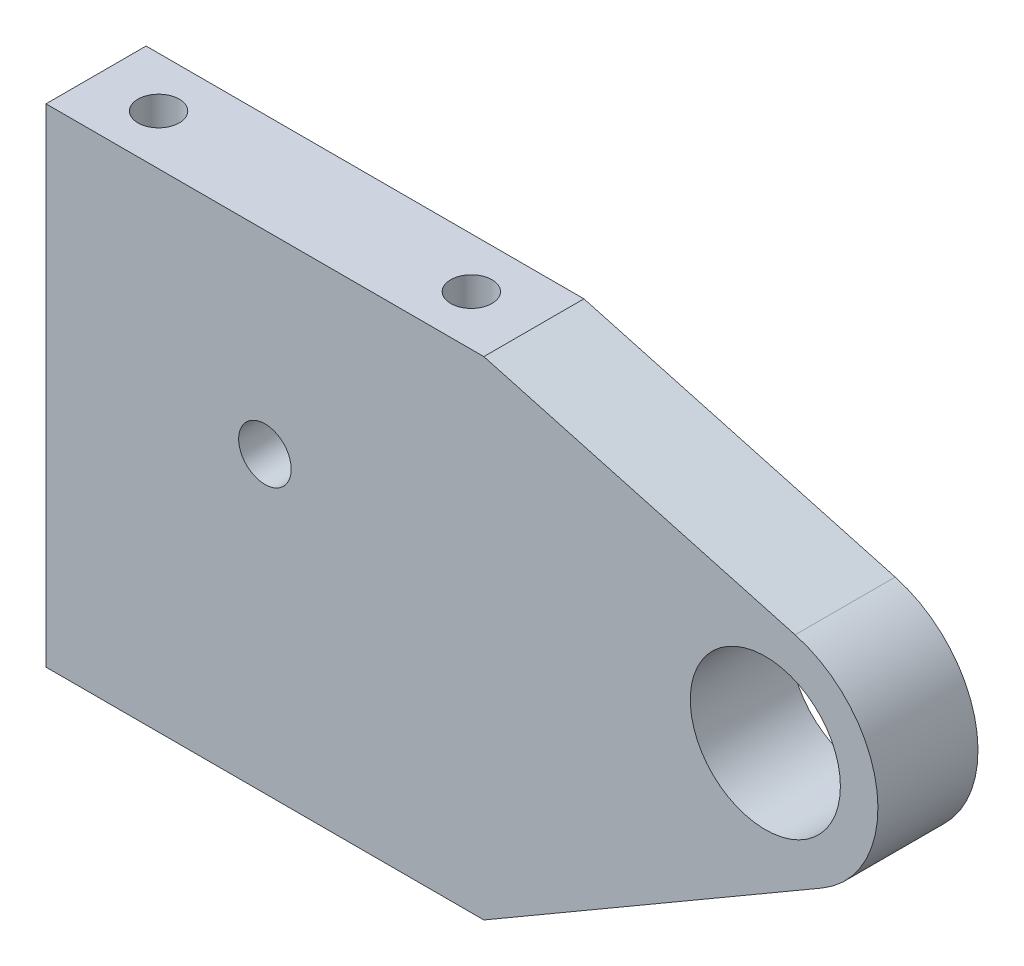
ISO-10303-21;
HEADER;
FILE_DESCRIPTION(('STEP AP214'),'2;1');
FILE_NAME('part.step','',(''),(''),'','','');
FILE_SCHEMA(('AUTOMOTIVE_DESIGN { 1 0 10303 214 1 1 1 1 }'));
ENDSEC;
DATA;
#1=APPLICATION_CONTEXT('core data for automotive mechanical design processes');
#2=APPLICATION_PROTOCOL_DEFINITION('international standard','automotive_design',2000,#1);
#3=PRODUCT_CONTEXT('',#1,'mechanical');
#4=PRODUCT('Part','Part','',(#3));
#5=PRODUCT_RELATED_PRODUCT_CATEGORY('part','',(#4));
#6=PRODUCT_DEFINITION_FORMATION('','',#4);
#7=PRODUCT_DEFINITION_CONTEXT('part definition',#1,'design');
#8=PRODUCT_DEFINITION('design','',#6,#7);
#9=PRODUCT_DEFINITION_SHAPE('','',#8);
#10=(LENGTH_UNIT() NAMED_UNIT(*) SI_UNIT(.MILLI.,.METRE.));
#11=(NAMED_UNIT(*) PLANE_ANGLE_UNIT() SI_UNIT($,.RADIAN.));
#12=(NAMED_UNIT(*) SI_UNIT($,.STERADIAN.) SOLID_ANGLE_UNIT());
#13=UNCERTAINTY_MEASURE_WITH_UNIT(LENGTH_MEASURE(1.E-05),#10,'distance_accuracy_value','');
#14=(GEOMETRIC_REPRESENTATION_CONTEXT(3) GLOBAL_UNCERTAINTY_ASSIGNED_CONTEXT((#13)) GLOBAL_UNIT_ASSIGNED_CONTEXT((#10,
#11,#12)) REPRESENTATION_CONTEXT('',''));
#15=CARTESIAN_POINT('',(0.,0.,0.));
#16=DIRECTION('',(0.,0.,1.));
#17=DIRECTION('',(1.,0.,0.));
#18=AXIS2_PLACEMENT_3D('',#15,#16,#17);
#19=CARTESIAN_POINT('',(0.,39.,8.));
#20=DIRECTION('',(0.,-1.,0.));
#21=DIRECTION('',(0.,0.,-1.));
#22=AXIS2_PLACEMENT_3D('',#19,#20,#21);
#23=PLANE('',#22);
#24=DIRECTION('',(-1.,0.,0.));
#25=VECTOR('',#24,1.);
#26=CARTESIAN_POINT('',(0.,39.,0.));
#27=LINE('',#26,#25);
#28=CARTESIAN_POINT('',(35.,39.,0.));
#29=VERTEX_POINT('',#28);
#30=CARTESIAN_POINT('',(0.,39.,0.));
#31=VERTEX_POINT('',#30);
#32=EDGE_CURVE('E70',#29,#31,#27,.T.);
#33=ORIENTED_EDGE('',*,*,#32,.T.);
#34=DIRECTION('',(0.,0.,-1.));
#35=VECTOR('',#34,1.);
#36=CARTESIAN_POINT('',(0.,39.,8.));
#37=LINE('',#36,#35);
#38=CARTESIAN_POINT('',(0.,39.,8.));
#39=VERTEX_POINT('',#38);
#40=EDGE_CURVE('E139',#39,#31,#37,.T.);
#41=ORIENTED_EDGE('',*,*,#40,.F.);
#42=DIRECTION('',(-1.,0.,0.));
#43=VECTOR('',#42,1.);
#44=CARTESIAN_POINT('',(0.,39.,8.));
#45=LINE('',#44,#43);
#46=CARTESIAN_POINT('',(35.,39.,8.));
#47=VERTEX_POINT('',#46);
#48=EDGE_CURVE('E53',#47,#39,#45,.T.);
#49=ORIENTED_EDGE('',*,*,#48,.F.);
#50=DIRECTION('',(0.,0.,-1.));
#51=VECTOR('',#50,1.);
#52=CARTESIAN_POINT('',(35.,39.,8.));
#53=LINE('',#52,#51);
#54=EDGE_CURVE('E67',#47,#29,#53,.T.);
#55=ORIENTED_EDGE('',*,*,#54,.T.);
#56=EDGE_LOOP('',(#33,#41,#49,#55));
#57=FACE_BOUND('',#56,.T.);
#58=CARTESIAN_POINT('',(30.,39.,4.));
#59=DIRECTION('',(0.,1.,0.));
#60=DIRECTION('',(0.,0.,1.));
#61=AXIS2_PLACEMENT_3D('',#58,#59,#60);
#62=CIRCLE('',#61,1.65);
#63=CARTESIAN_POINT('',(30.,39.,5.65));
#64=VERTEX_POINT('',#63);
#65=EDGE_CURVE('E201',#64,#64,#62,.T.);
#66=ORIENTED_EDGE('',*,*,#65,.F.);
#67=EDGE_LOOP('',(#66));
#68=FACE_BOUND('',#67,.T.);
#69=CARTESIAN_POINT('',(5.,39.,4.));
#70=DIRECTION('',(0.,1.,0.));
#71=DIRECTION('',(0.,0.,1.));
#72=AXIS2_PLACEMENT_3D('',#69,#70,#71);
#73=CIRCLE('',#72,1.65);
#74=CARTESIAN_POINT('',(5.,39.,5.65));
#75=VERTEX_POINT('',#74);
#76=EDGE_CURVE('E198',#75,#75,#73,.T.);
#77=ORIENTED_EDGE('',*,*,#76,.F.);
#78=EDGE_LOOP('',(#77));
#79=FACE_BOUND('',#78,.T.);
#80=ADVANCED_FACE('F36',(#57,#68,#79),#23,.F.);
#81=CARTESIAN_POINT('',(0.,0.,8.));
#82=DIRECTION('',(0.,0.,-1.));
#83=DIRECTION('',(-1.,0.,0.));
#84=AXIS2_PLACEMENT_3D('',#81,#82,#83);
#85=PLANE('',#84);
#86=DIRECTION('',(0.,-1.,0.));
#87=VECTOR('',#86,1.);
#88=CARTESIAN_POINT('',(0.,0.,8.));
#89=LINE('',#88,#87);
#90=CARTESIAN_POINT('',(0.,0.,8.));
#91=VERTEX_POINT('',#90);
#92=EDGE_CURVE('E135',#39,#91,#89,.T.);
#93=ORIENTED_EDGE('',*,*,#92,.T.);
#94=DIRECTION('',(1.,0.,0.));
#95=VECTOR('',#94,1.);
#96=CARTESIAN_POINT('',(0.,0.,8.));
#97=LINE('',#96,#95);
#98=CARTESIAN_POINT('',(35.,0.,8.));
#99=VERTEX_POINT('',#98);
#100=EDGE_CURVE('E77',#91,#99,#97,.T.);
#101=ORIENTED_EDGE('',*,*,#100,.T.);
#102=DIRECTION('',(0.864395294321074,0.502812862957566,0.));
#103=VECTOR('',#102,1.);
#104=CARTESIAN_POINT('',(62.0253157666181,15.7204423511103,8.));
#105=LINE('',#104,#103);
#106=CARTESIAN_POINT('',(62.0253157666181,15.7204423511103,8.));
#107=VERTEX_POINT('',#106);
#108=EDGE_CURVE('E211',#99,#107,#105,.T.);
#109=ORIENTED_EDGE('',*,*,#108,.T.);
#110=CARTESIAN_POINT('',(57.5,23.5,8.));
#111=DIRECTION('',(0.,0.,1.));
#112=DIRECTION('',(-1.,0.,0.));
#113=AXIS2_PLACEMENT_3D('',#110,#111,#112);
#114=CIRCLE('',#113,8.99999999999999);
#115=CARTESIAN_POINT('',(59.8793991851635,32.1797730107211,8.));
#116=VERTEX_POINT('',#115);
#117=EDGE_CURVE('E113',#107,#116,#114,.T.);
#118=ORIENTED_EDGE('',*,*,#117,.T.);
#119=DIRECTION('',(-0.964419223413462,0.264377687240386,0.));
#120=VECTOR('',#119,1.);
#121=CARTESIAN_POINT('',(35.,39.,8.));
#122=LINE('',#121,#120);
#123=EDGE_CURVE('E208',#116,#47,#122,.T.);
#124=ORIENTED_EDGE('',*,*,#123,.T.);
#125=ORIENTED_EDGE('',*,*,#48,.T.);
#126=EDGE_LOOP('',(#93,#101,#109,#118,#124,#125));
#127=FACE_BOUND('',#126,.T.);
#128=CARTESIAN_POINT('',(17.5,23.5,8.));
#129=DIRECTION('',(0.,0.,1.));
#130=DIRECTION('',(1.,0.,0.));
#131=AXIS2_PLACEMENT_3D('',#128,#129,#130);
#132=CIRCLE('',#131,2.1);
#133=CARTESIAN_POINT('',(19.6,23.5,8.));
#134=VERTEX_POINT('',#133);
#135=EDGE_CURVE('E128',#134,#134,#132,.T.);
#136=ORIENTED_EDGE('',*,*,#135,.F.);
#137=EDGE_LOOP('',(#136));
#138=FACE_BOUND('',#137,.T.);
#139=CARTESIAN_POINT('',(57.5,23.5,8.));
#140=DIRECTION('',(0.,0.,1.));
#141=DIRECTION('',(1.,0.,0.));
#142=AXIS2_PLACEMENT_3D('',#139,#140,#141);
#143=CIRCLE('',#142,6.);
#144=CARTESIAN_POINT('',(63.5,23.5,8.));
#145=VERTEX_POINT('',#144);
#146=EDGE_CURVE('E117',#145,#145,#143,.T.);
#147=ORIENTED_EDGE('',*,*,#146,.F.);
#148=EDGE_LOOP('',(#147));
#149=FACE_BOUND('',#148,.T.);
#150=ADVANCED_FACE('F164',(#127,#138,#149),#85,.F.);
#151=CARTESIAN_POINT('',(0.,0.,0.));
#152=DIRECTION('',(0.,0.,-1.));
#153=DIRECTION('',(-1.,0.,0.));
#154=AXIS2_PLACEMENT_3D('',#151,#152,#153);
#155=PLANE('',#154);
#156=DIRECTION('',(0.,-1.,0.));
#157=VECTOR('',#156,1.);
#158=CARTESIAN_POINT('',(0.,0.,0.));
#159=LINE('',#158,#157);
#160=CARTESIAN_POINT('',(0.,0.,0.));
#161=VERTEX_POINT('',#160);
#162=EDGE_CURVE('E131',#31,#161,#159,.T.);
#163=ORIENTED_EDGE('',*,*,#162,.F.);
#164=ORIENTED_EDGE('',*,*,#32,.F.);
#165=DIRECTION('',(-0.964419223413462,0.264377687240386,0.));
#166=VECTOR('',#165,1.);
#167=CARTESIAN_POINT('',(35.,39.,0.));
#168=LINE('',#167,#166);
#169=CARTESIAN_POINT('',(59.8793991851635,32.1797730107212,0.));
#170=VERTEX_POINT('',#169);
#171=EDGE_CURVE('E104',#170,#29,#168,.T.);
#172=ORIENTED_EDGE('',*,*,#171,.F.);
#173=CARTESIAN_POINT('',(57.5,23.5,0.));
#174=DIRECTION('',(0.,0.,-1.));
#175=DIRECTION('',(-1.,0.,0.));
#176=AXIS2_PLACEMENT_3D('',#173,#174,#175);
#177=CIRCLE('',#176,8.99999999999999);
#178=CARTESIAN_POINT('',(62.0253157666181,15.7204423511103,0.));
#179=VERTEX_POINT('',#178);
#180=EDGE_CURVE('E95',#179,#170,#177,.F.);
#181=ORIENTED_EDGE('',*,*,#180,.F.);
#182=DIRECTION('',(0.864395294321074,0.502812862957566,0.));
#183=VECTOR('',#182,1.);
#184=CARTESIAN_POINT('',(62.0253157666181,15.7204423511103,0.));
#185=LINE('',#184,#183);
#186=CARTESIAN_POINT('',(35.,0.,0.));
#187=VERTEX_POINT('',#186);
#188=EDGE_CURVE('E101',#187,#179,#185,.T.);
#189=ORIENTED_EDGE('',*,*,#188,.F.);
#190=DIRECTION('',(1.,0.,0.));
#191=VECTOR('',#190,1.);
#192=CARTESIAN_POINT('',(0.,0.,0.));
#193=LINE('',#192,#191);
#194=EDGE_CURVE('E142',#161,#187,#193,.T.);
#195=ORIENTED_EDGE('',*,*,#194,.F.);
#196=EDGE_LOOP('',(#163,#164,#172,#181,#189,#195));
#197=FACE_BOUND('',#196,.T.);
#198=CARTESIAN_POINT('',(17.5,23.5,0.));
#199=DIRECTION('',(0.,0.,1.));
#200=DIRECTION('',(1.,0.,0.));
#201=AXIS2_PLACEMENT_3D('',#198,#199,#200);
#202=CIRCLE('',#201,2.1);
#203=CARTESIAN_POINT('',(19.6,23.5,0.));
#204=VERTEX_POINT('',#203);
#205=EDGE_CURVE('E132',#204,#204,#202,.T.);
#206=ORIENTED_EDGE('',*,*,#205,.T.);
#207=EDGE_LOOP('',(#206));
#208=FACE_BOUND('',#207,.T.);
#209=CARTESIAN_POINT('',(57.5,23.5,0.));
#210=DIRECTION('',(0.,0.,-1.));
#211=DIRECTION('',(-1.,0.,0.));
#212=AXIS2_PLACEMENT_3D('',#209,#210,#211);
#213=CIRCLE('',#212,6.);
#214=CARTESIAN_POINT('',(51.5,23.5,0.));
#215=VERTEX_POINT('',#214);
#216=EDGE_CURVE('E124',#215,#215,#213,.F.);
#217=ORIENTED_EDGE('',*,*,#216,.T.);
#218=EDGE_LOOP('',(#217));
#219=FACE_BOUND('',#218,.T.);
#220=ADVANCED_FACE('F98',(#197,#208,#219),#155,.T.);
#221=CARTESIAN_POINT('',(0.,0.,8.));
#222=DIRECTION('',(1.,0.,0.));
#223=DIRECTION('',(0.,0.,-1.));
#224=AXIS2_PLACEMENT_3D('',#221,#222,#223);
#225=PLANE('',#224);
#226=ORIENTED_EDGE('',*,*,#162,.T.);
#227=DIRECTION('',(0.,0.,-1.));
#228=VECTOR('',#227,1.);
#229=CARTESIAN_POINT('',(0.,0.,8.));
#230=LINE('',#229,#228);
#231=EDGE_CURVE('E11',#91,#161,#230,.T.);
#232=ORIENTED_EDGE('',*,*,#231,.F.);
#233=ORIENTED_EDGE('',*,*,#92,.F.);
#234=ORIENTED_EDGE('',*,*,#40,.T.);
#235=EDGE_LOOP('',(#226,#232,#233,#234));
#236=FACE_BOUND('',#235,.T.);
#237=ADVANCED_FACE('F38',(#236),#225,.F.);
#238=CARTESIAN_POINT('',(0.,0.,8.));
#239=DIRECTION('',(0.,1.,0.));
#240=DIRECTION('',(0.,0.,1.));
#241=AXIS2_PLACEMENT_3D('',#238,#239,#240);
#242=PLANE('',#241);
#243=CARTESIAN_POINT('',(5.,0.,4.));
#244=DIRECTION('',(0.,1.,0.));
#245=DIRECTION('',(0.,0.,1.));
#246=AXIS2_PLACEMENT_3D('',#243,#244,#245);
#247=CIRCLE('',#246,1.64999999999999);
#248=CARTESIAN_POINT('',(5.,0.,5.64999999999999));
#249=VERTEX_POINT('',#248);
#250=EDGE_CURVE('E195',#249,#249,#247,.T.);
#251=ORIENTED_EDGE('',*,*,#250,.T.);
#252=EDGE_LOOP('',(#251));
#253=FACE_BOUND('',#252,.T.);
#254=CARTESIAN_POINT('',(30.,0.,4.));
#255=DIRECTION('',(0.,1.,0.));
#256=DIRECTION('',(0.,0.,1.));
#257=AXIS2_PLACEMENT_3D('',#254,#255,#256);
#258=CIRCLE('',#257,1.65);
#259=CARTESIAN_POINT('',(30.,0.,5.65));
#260=VERTEX_POINT('',#259);
#261=EDGE_CURVE('E126',#260,#260,#258,.T.);
#262=ORIENTED_EDGE('',*,*,#261,.T.);
#263=EDGE_LOOP('',(#262));
#264=FACE_BOUND('',#263,.T.);
#265=ORIENTED_EDGE('',*,*,#194,.T.);
#266=DIRECTION('',(0.,0.,-1.));
#267=VECTOR('',#266,1.);
#268=CARTESIAN_POINT('',(35.,0.,8.));
#269=LINE('',#268,#267);
#270=EDGE_CURVE('E45',#99,#187,#269,.T.);
#271=ORIENTED_EDGE('',*,*,#270,.F.);
#272=ORIENTED_EDGE('',*,*,#100,.F.);
#273=ORIENTED_EDGE('',*,*,#231,.T.);
#274=EDGE_LOOP('',(#265,#271,#272,#273));
#275=FACE_BOUND('',#274,.T.);
#276=ADVANCED_FACE('F149',(#253,#264,#275),#242,.F.);
#277=CARTESIAN_POINT('',(17.5,23.5,8.));
#278=DIRECTION('',(0.,0.,-1.));
#279=DIRECTION('',(-1.,0.,0.));
#280=AXIS2_PLACEMENT_3D('',#277,#278,#279);
#281=CYLINDRICAL_SURFACE('',#280,2.1);
#282=ORIENTED_EDGE('',*,*,#135,.T.);
#283=EDGE_LOOP('',(#282));
#284=FACE_BOUND('',#283,.T.);
#285=ORIENTED_EDGE('',*,*,#205,.F.);
#286=EDGE_LOOP('',(#285));
#287=FACE_BOUND('',#286,.T.);
#288=ADVANCED_FACE('F151',(#284,#287),#281,.F.);
#289=CARTESIAN_POINT('',(35.,39.,-50.1323249012052));
#290=DIRECTION('',(0.264377687240386,0.964419223413462,0.));
#291=DIRECTION('',(-0.964419223413462,0.264377687240386,0.));
#292=AXIS2_PLACEMENT_3D('',#289,#290,#291);
#293=PLANE('',#292);
#294=DIRECTION('',(0.,0.,1.));
#295=VECTOR('',#294,1.);
#296=CARTESIAN_POINT('',(59.8793991851635,32.1797730107211,-50.1323249012052));
#297=LINE('',#296,#295);
#298=EDGE_CURVE('E107',#170,#116,#297,.T.);
#299=ORIENTED_EDGE('',*,*,#298,.F.);
#300=ORIENTED_EDGE('',*,*,#171,.T.);
#301=ORIENTED_EDGE('',*,*,#54,.F.);
#302=ORIENTED_EDGE('',*,*,#123,.F.);
#303=EDGE_LOOP('',(#299,#300,#301,#302));
#304=FACE_BOUND('',#303,.T.);
#305=ADVANCED_FACE('F157',(#304),#293,.T.);
#306=CARTESIAN_POINT('',(57.5,23.5,-50.1323249012052));
#307=DIRECTION('',(0.,0.,1.));
#308=DIRECTION('',(1.,0.,0.));
#309=AXIS2_PLACEMENT_3D('',#306,#307,#308);
#310=CYLINDRICAL_SURFACE('',#309,8.99999999999999);
#311=DIRECTION('',(0.,0.,1.));
#312=VECTOR('',#311,1.);
#313=CARTESIAN_POINT('',(62.0253157666181,15.7204423511103,-50.1323249012052));
#314=LINE('',#313,#312);
#315=EDGE_CURVE('E110',#179,#107,#314,.T.);
#316=ORIENTED_EDGE('',*,*,#315,.F.);
#317=ORIENTED_EDGE('',*,*,#180,.T.);
#318=ORIENTED_EDGE('',*,*,#298,.T.);
#319=ORIENTED_EDGE('',*,*,#117,.F.);
#320=EDGE_LOOP('',(#316,#317,#318,#319));
#321=FACE_BOUND('',#320,.T.);
#322=ADVANCED_FACE('F111',(#321),#310,.T.);
#323=CARTESIAN_POINT('',(62.0253157666181,15.7204423511103,-50.1323249012052));
#324=DIRECTION('',(0.502812862957566,-0.864395294321074,0.));
#325=DIRECTION('',(0.864395294321074,0.502812862957566,0.));
#326=AXIS2_PLACEMENT_3D('',#323,#324,#325);
#327=PLANE('',#326);
#328=ORIENTED_EDGE('',*,*,#270,.T.);
#329=ORIENTED_EDGE('',*,*,#188,.T.);
#330=ORIENTED_EDGE('',*,*,#315,.T.);
#331=ORIENTED_EDGE('',*,*,#108,.F.);
#332=EDGE_LOOP('',(#328,#329,#330,#331));
#333=FACE_BOUND('',#332,.T.);
#334=ADVANCED_FACE('F119',(#333),#327,.T.);
#335=CARTESIAN_POINT('',(57.5,23.5,-50.1323249012052));
#336=DIRECTION('',(0.,0.,1.));
#337=DIRECTION('',(1.,0.,0.));
#338=AXIS2_PLACEMENT_3D('',#335,#336,#337);
#339=CYLINDRICAL_SURFACE('',#338,6.);
#340=ORIENTED_EDGE('',*,*,#146,.T.);
#341=EDGE_LOOP('',(#340));
#342=FACE_BOUND('',#341,.T.);
#343=ORIENTED_EDGE('',*,*,#216,.F.);
#344=EDGE_LOOP('',(#343));
#345=FACE_BOUND('',#344,.T.);
#346=ADVANCED_FACE('F173',(#342,#345),#339,.F.);
#347=CARTESIAN_POINT('',(30.,39.,4.));
#348=DIRECTION('',(0.,1.,0.));
#349=DIRECTION('',(0.,0.,1.));
#350=AXIS2_PLACEMENT_3D('',#347,#348,#349);
#351=CYLINDRICAL_SURFACE('',#350,1.65);
#352=ORIENTED_EDGE('',*,*,#261,.F.);
#353=EDGE_LOOP('',(#352));
#354=FACE_BOUND('',#353,.T.);
#355=ORIENTED_EDGE('',*,*,#65,.T.);
#356=EDGE_LOOP('',(#355));
#357=FACE_BOUND('',#356,.T.);
#358=ADVANCED_FACE('F176',(#354,#357),#351,.F.);
#359=CARTESIAN_POINT('',(5.,39.,4.));
#360=DIRECTION('',(0.,1.,0.));
#361=DIRECTION('',(0.,0.,1.));
#362=AXIS2_PLACEMENT_3D('',#359,#360,#361);
#363=CYLINDRICAL_SURFACE('',#362,1.65);
#364=ORIENTED_EDGE('',*,*,#250,.F.);
#365=EDGE_LOOP('',(#364));
#366=FACE_BOUND('',#365,.T.);
#367=ORIENTED_EDGE('',*,*,#76,.T.);
#368=EDGE_LOOP('',(#367));
#369=FACE_BOUND('',#368,.T.);
#370=ADVANCED_FACE('F187',(#366,#369),#363,.F.);
#371=CLOSED_SHELL('',(#80,#150,#220,#237,#276,#288,#305,#322,#334,#346,#358,#370));
#372=MANIFOLD_SOLID_BREP('B2',#371);
#373=ADVANCED_BREP_SHAPE_REPRESENTATION('',(#18,#372),#14);
#374=SHAPE_DEFINITION_REPRESENTATION(#9,#373);
ENDSEC;
END-ISO-10303-21;
